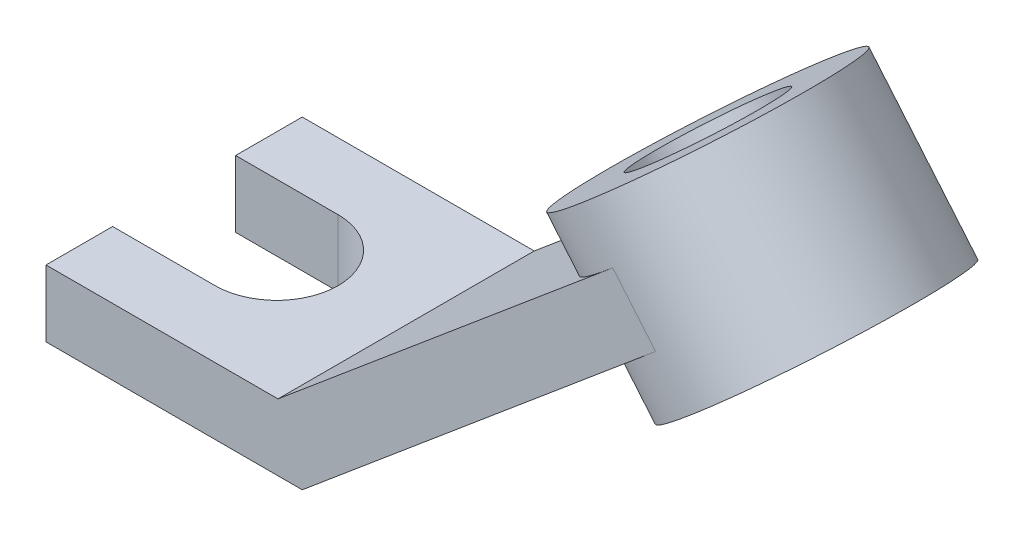
ISO-10303-21;
HEADER;
FILE_DESCRIPTION(('STEP AP214'),'2;1');
FILE_NAME('part.step','',(''),(''),'','','');
FILE_SCHEMA(('AUTOMOTIVE_DESIGN { 1 0 10303 214 1 1 1 1 }'));
ENDSEC;
DATA;
#1=APPLICATION_CONTEXT('core data for automotive mechanical design processes');
#2=APPLICATION_PROTOCOL_DEFINITION('international standard','automotive_design',2000,#1);
#3=PRODUCT_CONTEXT('',#1,'mechanical');
#4=PRODUCT('Part','Part','',(#3));
#5=PRODUCT_RELATED_PRODUCT_CATEGORY('part','',(#4));
#6=PRODUCT_DEFINITION_FORMATION('','',#4);
#7=PRODUCT_DEFINITION_CONTEXT('part definition',#1,'design');
#8=PRODUCT_DEFINITION('design','',#6,#7);
#9=PRODUCT_DEFINITION_SHAPE('','',#8);
#10=(LENGTH_UNIT() NAMED_UNIT(*) SI_UNIT(.MILLI.,.METRE.));
#11=(NAMED_UNIT(*) PLANE_ANGLE_UNIT() SI_UNIT($,.RADIAN.));
#12=(NAMED_UNIT(*) SI_UNIT($,.STERADIAN.) SOLID_ANGLE_UNIT());
#13=UNCERTAINTY_MEASURE_WITH_UNIT(LENGTH_MEASURE(1.E-05),#10,'distance_accuracy_value','');
#14=(GEOMETRIC_REPRESENTATION_CONTEXT(3) GLOBAL_UNCERTAINTY_ASSIGNED_CONTEXT((#13)) GLOBAL_UNIT_ASSIGNED_CONTEXT((#10,
#11,#12)) REPRESENTATION_CONTEXT('',''));
#15=CARTESIAN_POINT('',(0.,0.,0.));
#16=DIRECTION('',(0.,0.,1.));
#17=DIRECTION('',(1.,0.,0.));
#18=AXIS2_PLACEMENT_3D('',#15,#16,#17);
#19=CARTESIAN_POINT('',(0.,0.,50.));
#20=DIRECTION('',(-1.,0.,0.));
#21=DIRECTION('',(0.,0.,1.));
#22=AXIS2_PLACEMENT_3D('',#19,#20,#21);
#23=PLANE('',#22);
#24=DIRECTION('',(0.,1.,0.));
#25=VECTOR('',#24,1.);
#26=CARTESIAN_POINT('',(0.,-6.501,13.));
#27=LINE('',#26,#25);
#28=CARTESIAN_POINT('',(0.,-6.5,13.));
#29=VERTEX_POINT('',#28);
#30=CARTESIAN_POINT('',(0.,6.5,13.));
#31=VERTEX_POINT('',#30);
#32=EDGE_CURVE('E187',#29,#31,#27,.T.);
#33=ORIENTED_EDGE('',*,*,#32,.T.);
#34=DIRECTION('',(0.,0.,-1.));
#35=VECTOR('',#34,1.);
#36=CARTESIAN_POINT('',(0.,6.5,50.));
#37=LINE('',#36,#35);
#38=CARTESIAN_POINT('',(0.,6.5,0.));
#39=VERTEX_POINT('',#38);
#40=EDGE_CURVE('E122',#31,#39,#37,.T.);
#41=ORIENTED_EDGE('',*,*,#40,.T.);
#42=DIRECTION('',(0.,1.,0.));
#43=VECTOR('',#42,1.);
#44=CARTESIAN_POINT('',(0.,0.,0.));
#45=LINE('',#44,#43);
#46=CARTESIAN_POINT('',(0.,-6.5,0.));
#47=VERTEX_POINT('',#46);
#48=EDGE_CURVE('E155',#47,#39,#45,.T.);
#49=ORIENTED_EDGE('',*,*,#48,.F.);
#50=DIRECTION('',(0.,0.,-1.));
#51=VECTOR('',#50,1.);
#52=CARTESIAN_POINT('',(0.,-6.5,50.));
#53=LINE('',#52,#51);
#54=EDGE_CURVE('E164',#29,#47,#53,.T.);
#55=ORIENTED_EDGE('',*,*,#54,.F.);
#56=EDGE_LOOP('',(#33,#41,#49,#55));
#57=FACE_BOUND('',#56,.T.);
#58=ADVANCED_FACE('F41',(#57),#23,.T.);
#59=CARTESIAN_POINT('',(23.8594207556165,-28.4345504027227,50.));
#60=DIRECTION('',(-0.64278760968654,0.766044443118977,0.));
#61=DIRECTION('',(-0.766044443118977,-0.64278760968654,0.));
#62=AXIS2_PLACEMENT_3D('',#59,#60,#61);
#63=PLANE('',#62);
#64=DIRECTION('',(0.766044443118977,0.64278760968654,0.));
#65=VECTOR('',#64,1.);
#66=CARTESIAN_POINT('',(23.8594207556165,-28.4345504027227,0.));
#67=LINE('',#66,#65);
#68=CARTESIAN_POINT('',(50.,-6.5,0.));
#69=VERTEX_POINT('',#68);
#70=CARTESIAN_POINT('',(118.943999880708,51.3508848717886,0.));
#71=VERTEX_POINT('',#70);
#72=EDGE_CURVE('E140',#69,#71,#67,.T.);
#73=ORIENTED_EDGE('',*,*,#72,.T.);
#74=CARTESIAN_POINT('',(118.943999880708,51.3508848717886,25.));
#75=DIRECTION('',(-0.64278760968654,0.766044443118977,0.));
#76=DIRECTION('',(-0.766044443118977,-0.64278760968654,0.));
#77=AXIS2_PLACEMENT_3D('',#74,#75,#76);
#78=CIRCLE('',#77,25.);
#79=CARTESIAN_POINT('',(118.943999880708,51.3508848717886,50.));
#80=VERTEX_POINT('',#79);
#81=EDGE_CURVE('E98',#71,#80,#78,.T.);
#82=ORIENTED_EDGE('',*,*,#81,.T.);
#83=DIRECTION('',(0.766044443118977,0.64278760968654,0.));
#84=VECTOR('',#83,1.);
#85=CARTESIAN_POINT('',(23.8594207556165,-28.4345504027227,50.));
#86=LINE('',#85,#84);
#87=CARTESIAN_POINT('',(50.,-6.5,50.));
#88=VERTEX_POINT('',#87);
#89=EDGE_CURVE('E161',#88,#80,#86,.T.);
#90=ORIENTED_EDGE('',*,*,#89,.F.);
#91=DIRECTION('',(0.,0.,-1.));
#92=VECTOR('',#91,1.);
#93=CARTESIAN_POINT('',(50.,-6.5,50.));
#94=LINE('',#93,#92);
#95=EDGE_CURVE('E136',#88,#69,#94,.T.);
#96=ORIENTED_EDGE('',*,*,#95,.T.);
#97=EDGE_LOOP('',(#73,#82,#90,#96));
#98=FACE_BOUND('',#97,.T.);
#99=ADVANCED_FACE('F43',(#98),#63,.F.);
#100=CARTESIAN_POINT('',(15.5031818296915,-18.475972642176,50.));
#101=DIRECTION('',(-0.64278760968654,0.766044443118977,0.));
#102=DIRECTION('',(-0.766044443118977,-0.64278760968654,0.));
#103=AXIS2_PLACEMENT_3D('',#100,#101,#102);
#104=PLANE('',#103);
#105=CARTESIAN_POINT('',(110.587760954783,61.3094626323353,25.));
#106=DIRECTION('',(-0.64278760968654,0.766044443118977,0.));
#107=DIRECTION('',(-0.766044443118977,-0.64278760968654,0.));
#108=AXIS2_PLACEMENT_3D('',#105,#106,#107);
#109=CIRCLE('',#108,25.);
#110=CARTESIAN_POINT('',(110.587760954783,61.3094626323353,0.));
#111=VERTEX_POINT('',#110);
#112=CARTESIAN_POINT('',(110.587760954783,61.3094626323353,50.));
#113=VERTEX_POINT('',#112);
#114=EDGE_CURVE('E193',#111,#113,#109,.T.);
#115=ORIENTED_EDGE('',*,*,#114,.F.);
#116=DIRECTION('',(0.766044443118977,0.64278760968654,0.));
#117=VECTOR('',#116,1.);
#118=CARTESIAN_POINT('',(15.5031818296915,-18.475972642176,0.));
#119=LINE('',#118,#117);
#120=CARTESIAN_POINT('',(45.2683869545394,6.5,0.));
#121=VERTEX_POINT('',#120);
#122=EDGE_CURVE('E147',#121,#111,#119,.T.);
#123=ORIENTED_EDGE('',*,*,#122,.F.);
#124=DIRECTION('',(0.,0.,-1.));
#125=VECTOR('',#124,1.);
#126=CARTESIAN_POINT('',(45.2683869545394,6.5,50.));
#127=LINE('',#126,#125);
#128=CARTESIAN_POINT('',(45.2683869545394,6.5,50.));
#129=VERTEX_POINT('',#128);
#130=EDGE_CURVE('E11',#129,#121,#127,.T.);
#131=ORIENTED_EDGE('',*,*,#130,.F.);
#132=DIRECTION('',(0.766044443118977,0.64278760968654,0.));
#133=VECTOR('',#132,1.);
#134=CARTESIAN_POINT('',(15.5031818296915,-18.475972642176,50.));
#135=LINE('',#134,#133);
#136=EDGE_CURVE('E127',#129,#113,#135,.T.);
#137=ORIENTED_EDGE('',*,*,#136,.T.);
#138=EDGE_LOOP('',(#115,#123,#131,#137));
#139=FACE_BOUND('',#138,.T.);
#140=ADVANCED_FACE('F194',(#139),#104,.T.);
#141=CARTESIAN_POINT('',(0.,6.5,50.));
#142=DIRECTION('',(0.,1.,0.));
#143=DIRECTION('',(0.,0.,1.));
#144=AXIS2_PLACEMENT_3D('',#141,#142,#143);
#145=PLANE('',#144);
#146=DIRECTION('',(-1.,0.,0.));
#147=VECTOR('',#146,1.);
#148=CARTESIAN_POINT('',(0.,6.5,13.));
#149=LINE('',#148,#147);
#150=CARTESIAN_POINT('',(20.,6.5,13.));
#151=VERTEX_POINT('',#150);
#152=EDGE_CURVE('E344',#151,#31,#149,.T.);
#153=ORIENTED_EDGE('',*,*,#152,.F.);
#154=CARTESIAN_POINT('',(20.,6.5,25.));
#155=DIRECTION('',(0.,1.,0.));
#156=DIRECTION('',(0.,0.,1.));
#157=AXIS2_PLACEMENT_3D('',#154,#155,#156);
#158=CIRCLE('',#157,12.);
#159=CARTESIAN_POINT('',(20.,6.5,37.));
#160=VERTEX_POINT('',#159);
#161=EDGE_CURVE('E351',#160,#151,#158,.T.);
#162=ORIENTED_EDGE('',*,*,#161,.F.);
#163=DIRECTION('',(1.,0.,0.));
#164=VECTOR('',#163,1.);
#165=CARTESIAN_POINT('',(0.,6.5,37.));
#166=LINE('',#165,#164);
#167=CARTESIAN_POINT('',(0.,6.5,37.));
#168=VERTEX_POINT('',#167);
#169=EDGE_CURVE('E117',#168,#160,#166,.T.);
#170=ORIENTED_EDGE('',*,*,#169,.F.);
#171=CARTESIAN_POINT('',(0.,6.5,50.));
#172=VERTEX_POINT('',#171);
#173=EDGE_CURVE('E50',#172,#168,#37,.T.);
#174=ORIENTED_EDGE('',*,*,#173,.F.);
#175=DIRECTION('',(1.,0.,0.));
#176=VECTOR('',#175,1.);
#177=CARTESIAN_POINT('',(0.,6.5,50.));
#178=LINE('',#177,#176);
#179=EDGE_CURVE('E114',#172,#129,#178,.T.);
#180=ORIENTED_EDGE('',*,*,#179,.T.);
#181=ORIENTED_EDGE('',*,*,#130,.T.);
#182=DIRECTION('',(1.,0.,0.));
#183=VECTOR('',#182,1.);
#184=CARTESIAN_POINT('',(0.,6.5,0.));
#185=LINE('',#184,#183);
#186=EDGE_CURVE('E151',#39,#121,#185,.T.);
#187=ORIENTED_EDGE('',*,*,#186,.F.);
#188=ORIENTED_EDGE('',*,*,#40,.F.);
#189=EDGE_LOOP('',(#153,#162,#170,#174,#180,#181,#187,#188));
#190=FACE_BOUND('',#189,.T.);
#191=ADVANCED_FACE('F113',(#190),#145,.T.);
#192=DIRECTION('',(0.,-1.,0.));
#193=VECTOR('',#192,1.);
#194=CARTESIAN_POINT('',(0.,-6.501,37.));
#195=LINE('',#194,#193);
#196=CARTESIAN_POINT('',(0.,-6.5,37.));
#197=VERTEX_POINT('',#196);
#198=EDGE_CURVE('E364',#168,#197,#195,.T.);
#199=ORIENTED_EDGE('',*,*,#198,.T.);
#200=CARTESIAN_POINT('',(0.,-6.5,50.));
#201=VERTEX_POINT('',#200);
#202=EDGE_CURVE('E132',#201,#197,#53,.T.);
#203=ORIENTED_EDGE('',*,*,#202,.F.);
#204=DIRECTION('',(0.,1.,0.));
#205=VECTOR('',#204,1.);
#206=CARTESIAN_POINT('',(0.,0.,50.));
#207=LINE('',#206,#205);
#208=EDGE_CURVE('E125',#201,#172,#207,.T.);
#209=ORIENTED_EDGE('',*,*,#208,.T.);
#210=ORIENTED_EDGE('',*,*,#173,.T.);
#211=EDGE_LOOP('',(#199,#203,#209,#210));
#212=FACE_BOUND('',#211,.T.);
#213=ADVANCED_FACE('F130',(#212),#23,.T.);
#214=CARTESIAN_POINT('',(0.,-6.5,50.));
#215=DIRECTION('',(0.,1.,0.));
#216=DIRECTION('',(0.,0.,1.));
#217=AXIS2_PLACEMENT_3D('',#214,#215,#216);
#218=PLANE('',#217);
#219=CARTESIAN_POINT('',(20.,-6.5,25.));
#220=DIRECTION('',(0.,1.,0.));
#221=DIRECTION('',(0.,0.,1.));
#222=AXIS2_PLACEMENT_3D('',#219,#220,#221);
#223=CIRCLE('',#222,12.);
#224=CARTESIAN_POINT('',(20.,-6.5,13.));
#225=VERTEX_POINT('',#224);
#226=CARTESIAN_POINT('',(20.,-6.5,37.));
#227=VERTEX_POINT('',#226);
#228=EDGE_CURVE('E359',#225,#227,#223,.F.);
#229=ORIENTED_EDGE('',*,*,#228,.F.);
#230=DIRECTION('',(1.,0.,0.));
#231=VECTOR('',#230,1.);
#232=CARTESIAN_POINT('',(0.,-6.5,13.));
#233=LINE('',#232,#231);
#234=EDGE_CURVE('E176',#29,#225,#233,.T.);
#235=ORIENTED_EDGE('',*,*,#234,.F.);
#236=ORIENTED_EDGE('',*,*,#54,.T.);
#237=DIRECTION('',(1.,0.,0.));
#238=VECTOR('',#237,1.);
#239=CARTESIAN_POINT('',(0.,-6.5,0.));
#240=LINE('',#239,#238);
#241=EDGE_CURVE('E89',#47,#69,#240,.T.);
#242=ORIENTED_EDGE('',*,*,#241,.T.);
#243=ORIENTED_EDGE('',*,*,#95,.F.);
#244=DIRECTION('',(1.,0.,0.));
#245=VECTOR('',#244,1.);
#246=CARTESIAN_POINT('',(0.,-6.5,50.));
#247=LINE('',#246,#245);
#248=EDGE_CURVE('E66',#201,#88,#247,.T.);
#249=ORIENTED_EDGE('',*,*,#248,.F.);
#250=ORIENTED_EDGE('',*,*,#202,.T.);
#251=DIRECTION('',(-1.,0.,0.));
#252=VECTOR('',#251,1.);
#253=CARTESIAN_POINT('',(0.,-6.5,37.));
#254=LINE('',#253,#252);
#255=EDGE_CURVE('E336',#227,#197,#254,.T.);
#256=ORIENTED_EDGE('',*,*,#255,.F.);
#257=EDGE_LOOP('',(#229,#235,#236,#242,#243,#249,#250,#256));
#258=FACE_BOUND('',#257,.T.);
#259=ADVANCED_FACE('F173',(#258),#218,.F.);
#260=CARTESIAN_POINT('',(0.,0.,50.));
#261=DIRECTION('',(0.,0.,1.));
#262=DIRECTION('',(1.,0.,0.));
#263=AXIS2_PLACEMENT_3D('',#260,#261,#262);
#264=PLANE('',#263);
#265=ORIENTED_EDGE('',*,*,#89,.T.);
#266=DIRECTION('',(-0.64278760968654,0.766044443118977,0.));
#267=VECTOR('',#266,1.);
#268=CARTESIAN_POINT('',(95.0845791250915,79.7854352745113,50.));
#269=LINE('',#268,#267);
#270=EDGE_CURVE('E201',#80,#113,#269,.T.);
#271=ORIENTED_EDGE('',*,*,#270,.T.);
#272=ORIENTED_EDGE('',*,*,#136,.F.);
#273=ORIENTED_EDGE('',*,*,#179,.F.);
#274=ORIENTED_EDGE('',*,*,#208,.F.);
#275=ORIENTED_EDGE('',*,*,#248,.T.);
#276=EDGE_LOOP('',(#265,#271,#272,#273,#274,#275));
#277=FACE_BOUND('',#276,.T.);
#278=ADVANCED_FACE('F124',(#277),#264,.T.);
#279=CARTESIAN_POINT('',(0.,0.,0.));
#280=DIRECTION('',(0.,0.,1.));
#281=DIRECTION('',(1.,0.,0.));
#282=AXIS2_PLACEMENT_3D('',#279,#280,#281);
#283=PLANE('',#282);
#284=ORIENTED_EDGE('',*,*,#72,.F.);
#285=ORIENTED_EDGE('',*,*,#241,.F.);
#286=ORIENTED_EDGE('',*,*,#48,.T.);
#287=ORIENTED_EDGE('',*,*,#186,.T.);
#288=ORIENTED_EDGE('',*,*,#122,.T.);
#289=DIRECTION('',(-0.64278760968654,0.766044443118977,0.));
#290=VECTOR('',#289,1.);
#291=CARTESIAN_POINT('',(95.0845791250915,79.7854352745113,0.));
#292=LINE('',#291,#290);
#293=EDGE_CURVE('E143',#71,#111,#292,.T.);
#294=ORIENTED_EDGE('',*,*,#293,.F.);
#295=EDGE_LOOP('',(#284,#285,#286,#287,#288,#294));
#296=FACE_BOUND('',#295,.T.);
#297=ADVANCED_FACE('F182',(#296),#283,.F.);
#298=CARTESIAN_POINT('',(125.371875977573,43.6904404405989,25.));
#299=DIRECTION('',(-0.64278760968654,0.766044443118977,0.));
#300=DIRECTION('',(-0.766044443118977,-0.64278760968654,0.));
#301=AXIS2_PLACEMENT_3D('',#298,#299,#300);
#302=CYLINDRICAL_SURFACE('',#301,25.);
#303=CARTESIAN_POINT('',(104.159884857918,68.9699070635251,25.));
#304=DIRECTION('',(-0.64278760968654,0.766044443118977,0.));
#305=DIRECTION('',(-0.766044443118977,-0.64278760968654,0.));
#306=AXIS2_PLACEMENT_3D('',#303,#304,#305);
#307=CIRCLE('',#306,25.);
#308=CARTESIAN_POINT('',(85.0087737799431,52.9002168213616,25.));
#309=VERTEX_POINT('',#308);
#310=EDGE_CURVE('E333',#309,#309,#307,.T.);
#311=ORIENTED_EDGE('',*,*,#310,.F.);
#312=EDGE_LOOP('',(#311));
#313=FACE_BOUND('',#312,.T.);
#314=CARTESIAN_POINT('',(125.371875977573,43.6904404405989,25.));
#315=DIRECTION('',(-0.64278760968654,0.766044443118977,0.));
#316=DIRECTION('',(-0.766044443118977,-0.64278760968654,0.));
#317=AXIS2_PLACEMENT_3D('',#314,#315,#316);
#318=CIRCLE('',#317,25.);
#319=CARTESIAN_POINT('',(106.220764899599,27.6207501984353,25.));
#320=VERTEX_POINT('',#319);
#321=EDGE_CURVE('E198',#320,#320,#318,.T.);
#322=ORIENTED_EDGE('',*,*,#321,.T.);
#323=EDGE_LOOP('',(#322));
#324=FACE_BOUND('',#323,.T.);
#325=ORIENTED_EDGE('',*,*,#81,.F.);
#326=ORIENTED_EDGE('',*,*,#293,.T.);
#327=ORIENTED_EDGE('',*,*,#114,.T.);
#328=ORIENTED_EDGE('',*,*,#270,.F.);
#329=EDGE_LOOP('',(#325,#326,#327,#328));
#330=FACE_BOUND('',#329,.T.);
#331=ADVANCED_FACE('F200',(#313,#324,#330),#302,.T.);
#332=CARTESIAN_POINT('',(125.371875977573,43.6904404405989,25.));
#333=DIRECTION('',(-0.64278760968654,0.766044443118977,0.));
#334=DIRECTION('',(-0.766044443118977,-0.64278760968654,0.));
#335=AXIS2_PLACEMENT_3D('',#332,#333,#334);
#336=PLANE('',#335);
#337=CARTESIAN_POINT('',(125.371875977573,43.6904404405989,25.));
#338=DIRECTION('',(-0.64278760968654,0.766044443118977,0.));
#339=DIRECTION('',(-0.766044443118977,-0.64278760968654,0.));
#340=AXIS2_PLACEMENT_3D('',#337,#338,#339);
#341=CIRCLE('',#340,13.);
#342=CARTESIAN_POINT('',(115.413298217027,35.3342015146738,25.));
#343=VERTEX_POINT('',#342);
#344=EDGE_CURVE('E328',#343,#343,#341,.T.);
#345=ORIENTED_EDGE('',*,*,#344,.T.);
#346=EDGE_LOOP('',(#345));
#347=FACE_BOUND('',#346,.T.);
#348=ORIENTED_EDGE('',*,*,#321,.F.);
#349=EDGE_LOOP('',(#348));
#350=FACE_BOUND('',#349,.T.);
#351=ADVANCED_FACE('F259',(#347,#350),#336,.F.);
#352=CARTESIAN_POINT('',(104.159884857918,68.9699070635251,25.));
#353=DIRECTION('',(-0.64278760968654,0.766044443118977,0.));
#354=DIRECTION('',(-0.766044443118977,-0.64278760968654,0.));
#355=AXIS2_PLACEMENT_3D('',#352,#353,#354);
#356=PLANE('',#355);
#357=CARTESIAN_POINT('',(104.159884857918,68.9699070635251,25.));
#358=DIRECTION('',(-0.64278760968654,0.766044443118977,0.));
#359=DIRECTION('',(-0.766044443118977,-0.64278760968654,0.));
#360=AXIS2_PLACEMENT_3D('',#357,#358,#359);
#361=CIRCLE('',#360,13.);
#362=CARTESIAN_POINT('',(94.2013070973708,60.6136681376001,25.));
#363=VERTEX_POINT('',#362);
#364=EDGE_CURVE('E369',#363,#363,#361,.T.);
#365=ORIENTED_EDGE('',*,*,#364,.F.);
#366=EDGE_LOOP('',(#365));
#367=FACE_BOUND('',#366,.T.);
#368=ORIENTED_EDGE('',*,*,#310,.T.);
#369=EDGE_LOOP('',(#368));
#370=FACE_BOUND('',#369,.T.);
#371=ADVANCED_FACE('F273',(#367,#370),#356,.T.);
#372=CARTESIAN_POINT('',(0.,-6.501,13.));
#373=DIRECTION('',(0.,0.,-1.));
#374=DIRECTION('',(-1.,0.,0.));
#375=AXIS2_PLACEMENT_3D('',#372,#373,#374);
#376=PLANE('',#375);
#377=ORIENTED_EDGE('',*,*,#234,.T.);
#378=DIRECTION('',(0.,1.,0.));
#379=VECTOR('',#378,1.);
#380=CARTESIAN_POINT('',(20.,-6.501,13.));
#381=LINE('',#380,#379);
#382=EDGE_CURVE('E341',#225,#151,#381,.T.);
#383=ORIENTED_EDGE('',*,*,#382,.T.);
#384=ORIENTED_EDGE('',*,*,#152,.T.);
#385=ORIENTED_EDGE('',*,*,#32,.F.);
#386=EDGE_LOOP('',(#377,#383,#384,#385));
#387=FACE_BOUND('',#386,.T.);
#388=ADVANCED_FACE('F277',(#387),#376,.F.);
#389=CARTESIAN_POINT('',(20.,-6.501,25.));
#390=DIRECTION('',(0.,1.,0.));
#391=DIRECTION('',(0.,0.,1.));
#392=AXIS2_PLACEMENT_3D('',#389,#390,#391);
#393=CYLINDRICAL_SURFACE('',#392,12.);
#394=ORIENTED_EDGE('',*,*,#228,.T.);
#395=DIRECTION('',(0.,1.,0.));
#396=VECTOR('',#395,1.);
#397=CARTESIAN_POINT('',(20.,-6.501,37.));
#398=LINE('',#397,#396);
#399=EDGE_CURVE('E57',#227,#160,#398,.T.);
#400=ORIENTED_EDGE('',*,*,#399,.T.);
#401=ORIENTED_EDGE('',*,*,#161,.T.);
#402=ORIENTED_EDGE('',*,*,#382,.F.);
#403=EDGE_LOOP('',(#394,#400,#401,#402));
#404=FACE_BOUND('',#403,.T.);
#405=ADVANCED_FACE('F283',(#404),#393,.F.);
#406=CARTESIAN_POINT('',(0.,-6.501,37.));
#407=DIRECTION('',(0.,0.,1.));
#408=DIRECTION('',(1.,0.,0.));
#409=AXIS2_PLACEMENT_3D('',#406,#407,#408);
#410=PLANE('',#409);
#411=ORIENTED_EDGE('',*,*,#255,.T.);
#412=ORIENTED_EDGE('',*,*,#198,.F.);
#413=ORIENTED_EDGE('',*,*,#169,.T.);
#414=ORIENTED_EDGE('',*,*,#399,.F.);
#415=EDGE_LOOP('',(#411,#412,#413,#414));
#416=FACE_BOUND('',#415,.T.);
#417=ADVANCED_FACE('F293',(#416),#410,.F.);
#418=CARTESIAN_POINT('',(157.998621183567,4.80739962670058,25.));
#419=DIRECTION('',(-0.64278760968654,0.766044443118977,0.));
#420=DIRECTION('',(-0.766044443118977,-0.64278760968654,0.));
#421=AXIS2_PLACEMENT_3D('',#418,#419,#420);
#422=CYLINDRICAL_SURFACE('',#421,13.);
#423=ORIENTED_EDGE('',*,*,#364,.T.);
#424=EDGE_LOOP('',(#423));
#425=FACE_BOUND('',#424,.T.);
#426=ORIENTED_EDGE('',*,*,#344,.F.);
#427=EDGE_LOOP('',(#426));
#428=FACE_BOUND('',#427,.T.);
#429=ADVANCED_FACE('F302',(#425,#428),#422,.F.);
#430=CLOSED_SHELL('',(#58,#99,#140,#191,#213,#259,#278,#297,#331,#351,#371,#388,#405,#417,#429));
#431=MANIFOLD_SOLID_BREP('B2',#430);
#432=ADVANCED_BREP_SHAPE_REPRESENTATION('',(#18,#431),#14);
#433=SHAPE_DEFINITION_REPRESENTATION(#9,#432);
ENDSEC;
END-ISO-10303-21;
